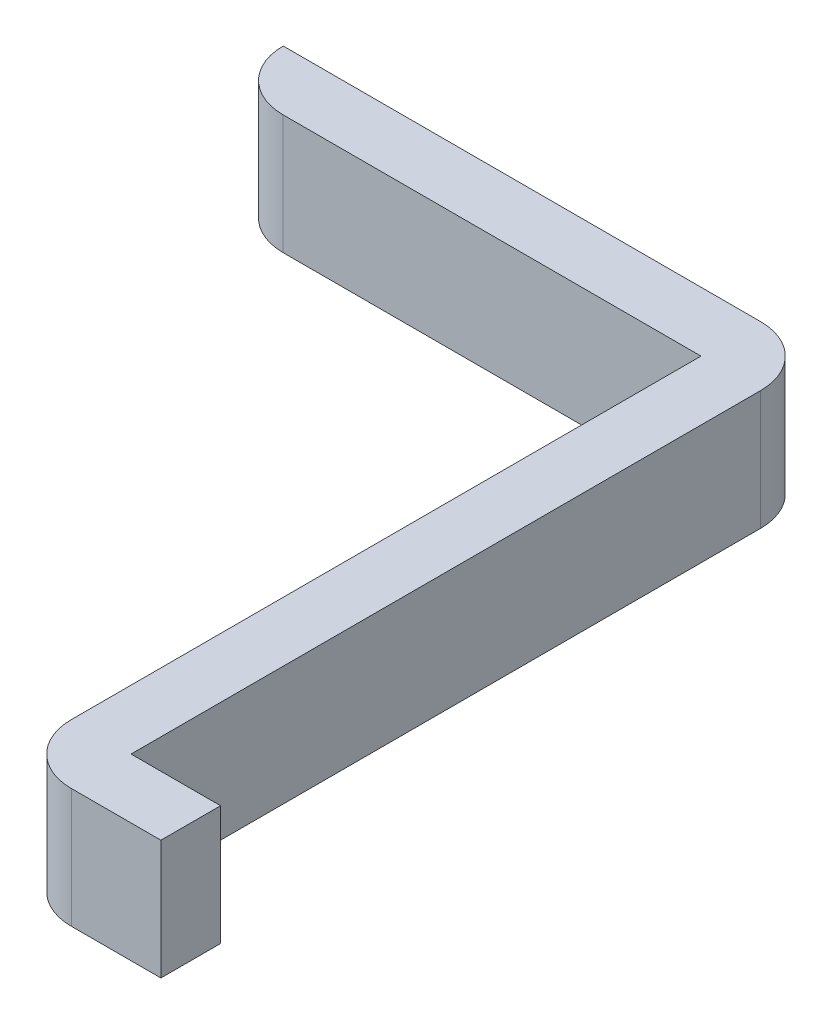
ISO-10303-21;
HEADER;
FILE_DESCRIPTION(('STEP AP214'),'2;1');
FILE_NAME('part.step','',(''),(''),'','','');
FILE_SCHEMA(('AUTOMOTIVE_DESIGN { 1 0 10303 214 1 1 1 1 }'));
ENDSEC;
DATA;
#1=APPLICATION_CONTEXT('core data for automotive mechanical design processes');
#2=APPLICATION_PROTOCOL_DEFINITION('international standard','automotive_design',2000,#1);
#3=PRODUCT_CONTEXT('',#1,'mechanical');
#4=PRODUCT('Part','Part','',(#3));
#5=PRODUCT_RELATED_PRODUCT_CATEGORY('part','',(#4));
#6=PRODUCT_DEFINITION_FORMATION('','',#4);
#7=PRODUCT_DEFINITION_CONTEXT('part definition',#1,'design');
#8=PRODUCT_DEFINITION('design','',#6,#7);
#9=PRODUCT_DEFINITION_SHAPE('','',#8);
#10=(LENGTH_UNIT() NAMED_UNIT(*) SI_UNIT(.MILLI.,.METRE.));
#11=(NAMED_UNIT(*) PLANE_ANGLE_UNIT() SI_UNIT($,.RADIAN.));
#12=(NAMED_UNIT(*) SI_UNIT($,.STERADIAN.) SOLID_ANGLE_UNIT());
#13=UNCERTAINTY_MEASURE_WITH_UNIT(LENGTH_MEASURE(1.E-05),#10,'distance_accuracy_value','');
#14=(GEOMETRIC_REPRESENTATION_CONTEXT(3) GLOBAL_UNCERTAINTY_ASSIGNED_CONTEXT((#13)) GLOBAL_UNIT_ASSIGNED_CONTEXT((#10,
#11,#12)) REPRESENTATION_CONTEXT('',''));
#15=CARTESIAN_POINT('',(0.,0.,0.));
#16=DIRECTION('',(0.,0.,1.));
#17=DIRECTION('',(1.,0.,0.));
#18=AXIS2_PLACEMENT_3D('',#15,#16,#17);
#19=CARTESIAN_POINT('',(-0.05,-1.2,0.));
#20=DIRECTION('',(0.,-1.,0.));
#21=DIRECTION('',(0.,0.,-1.));
#22=AXIS2_PLACEMENT_3D('',#19,#20,#21);
#23=PLANE('',#22);
#24=DIRECTION('',(-1.,0.,0.));
#25=VECTOR('',#24,1.);
#26=CARTESIAN_POINT('',(0.05,-1.2,0.1));
#27=LINE('',#26,#25);
#28=CARTESIAN_POINT('',(0.05,-1.2,0.1));
#29=VERTEX_POINT('',#28);
#30=CARTESIAN_POINT('',(0.75,-1.2,0.1));
#31=VERTEX_POINT('',#30);
#32=EDGE_CURVE('E102',#29,#31,#27,.F.);
#33=ORIENTED_EDGE('',*,*,#32,.T.);
#34=DIRECTION('',(0.,0.,-1.));
#35=VECTOR('',#34,1.);
#36=CARTESIAN_POINT('',(0.75,-1.2,0.1));
#37=LINE('',#36,#35);
#38=CARTESIAN_POINT('',(0.75,-1.2,1.155));
#39=VERTEX_POINT('',#38);
#40=EDGE_CURVE('E105',#31,#39,#37,.F.);
#41=ORIENTED_EDGE('',*,*,#40,.T.);
#42=CARTESIAN_POINT('',(0.85,-1.2,1.155));
#43=DIRECTION('',(0.,-1.,0.));
#44=DIRECTION('',(0.,0.,-1.));
#45=AXIS2_PLACEMENT_3D('',#42,#43,#44);
#46=CIRCLE('',#45,0.1);
#47=CARTESIAN_POINT('',(0.85,-1.2,1.255));
#48=VERTEX_POINT('',#47);
#49=EDGE_CURVE('E117',#48,#39,#46,.T.);
#50=ORIENTED_EDGE('',*,*,#49,.F.);
#51=DIRECTION('',(-1.,0.,0.));
#52=VECTOR('',#51,1.);
#53=CARTESIAN_POINT('',(0.85,-1.2,1.255));
#54=LINE('',#53,#52);
#55=CARTESIAN_POINT('',(1.,-1.2,1.255));
#56=VERTEX_POINT('',#55);
#57=EDGE_CURVE('E134',#48,#56,#54,.F.);
#58=ORIENTED_EDGE('',*,*,#57,.T.);
#59=DIRECTION('',(0.,0.,1.));
#60=VECTOR('',#59,1.);
#61=CARTESIAN_POINT('',(1.,-1.2,1.255));
#62=LINE('',#61,#60);
#63=CARTESIAN_POINT('',(1.,-1.2,1.155));
#64=VERTEX_POINT('',#63);
#65=EDGE_CURVE('E90',#56,#64,#62,.F.);
#66=ORIENTED_EDGE('',*,*,#65,.T.);
#67=DIRECTION('',(1.,0.,0.));
#68=VECTOR('',#67,1.);
#69=CARTESIAN_POINT('',(1.,-1.2,1.155));
#70=LINE('',#69,#68);
#71=CARTESIAN_POINT('',(0.85,-1.2,1.155));
#72=VERTEX_POINT('',#71);
#73=EDGE_CURVE('E87',#64,#72,#70,.F.);
#74=ORIENTED_EDGE('',*,*,#73,.T.);
#75=DIRECTION('',(0.,0.,1.));
#76=VECTOR('',#75,1.);
#77=CARTESIAN_POINT('',(0.85,-1.2,1.155));
#78=LINE('',#77,#76);
#79=CARTESIAN_POINT('',(0.85,-1.2,0.1));
#80=VERTEX_POINT('',#79);
#81=EDGE_CURVE('E82',#72,#80,#78,.F.);
#82=ORIENTED_EDGE('',*,*,#81,.T.);
#83=CARTESIAN_POINT('',(0.75,-1.2,0.1));
#84=DIRECTION('',(0.,-1.,0.));
#85=DIRECTION('',(0.,0.,-1.));
#86=AXIS2_PLACEMENT_3D('',#83,#84,#85);
#87=CIRCLE('',#86,0.1);
#88=CARTESIAN_POINT('',(0.75,-1.2,0.));
#89=VERTEX_POINT('',#88);
#90=EDGE_CURVE('E20',#89,#80,#87,.T.);
#91=ORIENTED_EDGE('',*,*,#90,.F.);
#92=DIRECTION('',(1.,0.,0.));
#93=VECTOR('',#92,1.);
#94=CARTESIAN_POINT('',(0.75,-1.2,0.));
#95=LINE('',#94,#93);
#96=CARTESIAN_POINT('',(-0.05,-1.2,0.));
#97=VERTEX_POINT('',#96);
#98=EDGE_CURVE('E76',#89,#97,#95,.F.);
#99=ORIENTED_EDGE('',*,*,#98,.T.);
#100=CARTESIAN_POINT('',(0.05,-1.2,0.));
#101=DIRECTION('',(0.,-1.,0.));
#102=DIRECTION('',(0.,0.,-1.));
#103=AXIS2_PLACEMENT_3D('',#100,#101,#102);
#104=CIRCLE('',#103,0.1);
#105=EDGE_CURVE('E108',#29,#97,#104,.T.);
#106=ORIENTED_EDGE('',*,*,#105,.F.);
#107=EDGE_LOOP('',(#33,#41,#50,#58,#66,#74,#82,#91,#99,#106));
#108=FACE_BOUND('',#107,.T.);
#109=ADVANCED_FACE('F17',(#108),#23,.F.);
#110=CARTESIAN_POINT('',(0.75,-1.4,0.));
#111=DIRECTION('',(0.,0.,1.));
#112=DIRECTION('',(1.,0.,0.));
#113=AXIS2_PLACEMENT_3D('',#110,#111,#112);
#114=PLANE('',#113);
#115=DIRECTION('',(0.,-1.,0.));
#116=VECTOR('',#115,1.);
#117=CARTESIAN_POINT('',(-0.05,-1.4,0.));
#118=LINE('',#117,#116);
#119=CARTESIAN_POINT('',(-0.05,-1.4,0.));
#120=VERTEX_POINT('',#119);
#121=EDGE_CURVE('E187',#97,#120,#118,.T.);
#122=ORIENTED_EDGE('',*,*,#121,.F.);
#123=ORIENTED_EDGE('',*,*,#98,.F.);
#124=DIRECTION('',(0.,-1.,0.));
#125=VECTOR('',#124,1.);
#126=CARTESIAN_POINT('',(0.75,-1.4,0.));
#127=LINE('',#126,#125);
#128=CARTESIAN_POINT('',(0.75,-1.4,0.));
#129=VERTEX_POINT('',#128);
#130=EDGE_CURVE('E159',#129,#89,#127,.F.);
#131=ORIENTED_EDGE('',*,*,#130,.F.);
#132=DIRECTION('',(1.,0.,0.));
#133=VECTOR('',#132,1.);
#134=CARTESIAN_POINT('',(-0.05,-1.4,0.));
#135=LINE('',#134,#133);
#136=EDGE_CURVE('E186',#120,#129,#135,.T.);
#137=ORIENTED_EDGE('',*,*,#136,.F.);
#138=EDGE_LOOP('',(#122,#123,#131,#137));
#139=FACE_BOUND('',#138,.T.);
#140=ADVANCED_FACE('F217',(#139),#114,.F.);
#141=CARTESIAN_POINT('',(0.75,-1.4,0.1));
#142=DIRECTION('',(0.,-1.,0.));
#143=DIRECTION('',(0.,0.,-1.));
#144=AXIS2_PLACEMENT_3D('',#141,#142,#143);
#145=CYLINDRICAL_SURFACE('',#144,0.1);
#146=ORIENTED_EDGE('',*,*,#90,.T.);
#147=DIRECTION('',(0.,1.,0.));
#148=VECTOR('',#147,1.);
#149=CARTESIAN_POINT('',(0.85,-1.4,0.1));
#150=LINE('',#149,#148);
#151=CARTESIAN_POINT('',(0.85,-1.4,0.1));
#152=VERTEX_POINT('',#151);
#153=EDGE_CURVE('E157',#80,#152,#150,.F.);
#154=ORIENTED_EDGE('',*,*,#153,.T.);
#155=CARTESIAN_POINT('',(0.75,-1.4,0.1));
#156=DIRECTION('',(0.,-1.,0.));
#157=DIRECTION('',(0.,0.,-1.));
#158=AXIS2_PLACEMENT_3D('',#155,#156,#157);
#159=CIRCLE('',#158,0.1);
#160=EDGE_CURVE('E183',#129,#152,#159,.T.);
#161=ORIENTED_EDGE('',*,*,#160,.F.);
#162=ORIENTED_EDGE('',*,*,#130,.T.);
#163=EDGE_LOOP('',(#146,#154,#161,#162));
#164=FACE_BOUND('',#163,.T.);
#165=ADVANCED_FACE('F214',(#164),#145,.T.);
#166=CARTESIAN_POINT('',(0.85,-1.4,1.155));
#167=DIRECTION('',(-1.,0.,0.));
#168=DIRECTION('',(0.,0.,1.));
#169=AXIS2_PLACEMENT_3D('',#166,#167,#168);
#170=PLANE('',#169);
#171=ORIENTED_EDGE('',*,*,#153,.F.);
#172=ORIENTED_EDGE('',*,*,#81,.F.);
#173=DIRECTION('',(0.,1.,0.));
#174=VECTOR('',#173,1.);
#175=CARTESIAN_POINT('',(0.85,-1.4,1.155));
#176=LINE('',#175,#174);
#177=CARTESIAN_POINT('',(0.85,-1.4,1.155));
#178=VERTEX_POINT('',#177);
#179=EDGE_CURVE('E153',#72,#178,#176,.F.);
#180=ORIENTED_EDGE('',*,*,#179,.T.);
#181=DIRECTION('',(0.,0.,-1.));
#182=VECTOR('',#181,1.);
#183=CARTESIAN_POINT('',(0.85,-1.4,0.));
#184=LINE('',#183,#182);
#185=EDGE_CURVE('E150',#152,#178,#184,.F.);
#186=ORIENTED_EDGE('',*,*,#185,.F.);
#187=EDGE_LOOP('',(#171,#172,#180,#186));
#188=FACE_BOUND('',#187,.T.);
#189=ADVANCED_FACE('F211',(#188),#170,.F.);
#190=CARTESIAN_POINT('',(1.,-1.4,1.155));
#191=DIRECTION('',(0.,0.,1.));
#192=DIRECTION('',(1.,0.,0.));
#193=AXIS2_PLACEMENT_3D('',#190,#191,#192);
#194=PLANE('',#193);
#195=ORIENTED_EDGE('',*,*,#179,.F.);
#196=ORIENTED_EDGE('',*,*,#73,.F.);
#197=DIRECTION('',(0.,1.,0.));
#198=VECTOR('',#197,1.);
#199=CARTESIAN_POINT('',(1.,-1.4,1.155));
#200=LINE('',#199,#198);
#201=CARTESIAN_POINT('',(1.,-1.4,1.155));
#202=VERTEX_POINT('',#201);
#203=EDGE_CURVE('E144',#64,#202,#200,.F.);
#204=ORIENTED_EDGE('',*,*,#203,.T.);
#205=DIRECTION('',(1.,0.,0.));
#206=VECTOR('',#205,1.);
#207=CARTESIAN_POINT('',(-0.05,-1.4,1.155));
#208=LINE('',#207,#206);
#209=EDGE_CURVE('E141',#178,#202,#208,.T.);
#210=ORIENTED_EDGE('',*,*,#209,.F.);
#211=EDGE_LOOP('',(#195,#196,#204,#210));
#212=FACE_BOUND('',#211,.T.);
#213=ADVANCED_FACE('F208',(#212),#194,.F.);
#214=CARTESIAN_POINT('',(1.,-1.4,1.255));
#215=DIRECTION('',(-1.,0.,0.));
#216=DIRECTION('',(0.,0.,1.));
#217=AXIS2_PLACEMENT_3D('',#214,#215,#216);
#218=PLANE('',#217);
#219=ORIENTED_EDGE('',*,*,#203,.F.);
#220=ORIENTED_EDGE('',*,*,#65,.F.);
#221=DIRECTION('',(0.,1.,0.));
#222=VECTOR('',#221,1.);
#223=CARTESIAN_POINT('',(1.,-1.4,1.255));
#224=LINE('',#223,#222);
#225=CARTESIAN_POINT('',(1.,-1.4,1.255));
#226=VERTEX_POINT('',#225);
#227=EDGE_CURVE('E132',#56,#226,#224,.F.);
#228=ORIENTED_EDGE('',*,*,#227,.T.);
#229=DIRECTION('',(0.,0.,-1.));
#230=VECTOR('',#229,1.);
#231=CARTESIAN_POINT('',(1.,-1.4,0.));
#232=LINE('',#231,#230);
#233=EDGE_CURVE('E137',#202,#226,#232,.F.);
#234=ORIENTED_EDGE('',*,*,#233,.F.);
#235=EDGE_LOOP('',(#219,#220,#228,#234));
#236=FACE_BOUND('',#235,.T.);
#237=ADVANCED_FACE('F195',(#236),#218,.F.);
#238=CARTESIAN_POINT('',(0.85,-1.4,1.255));
#239=DIRECTION('',(0.,0.,-1.));
#240=DIRECTION('',(-1.,0.,0.));
#241=AXIS2_PLACEMENT_3D('',#238,#239,#240);
#242=PLANE('',#241);
#243=ORIENTED_EDGE('',*,*,#227,.F.);
#244=ORIENTED_EDGE('',*,*,#57,.F.);
#245=DIRECTION('',(0.,-1.,0.));
#246=VECTOR('',#245,1.);
#247=CARTESIAN_POINT('',(0.85,-1.4,1.255));
#248=LINE('',#247,#246);
#249=CARTESIAN_POINT('',(0.85,-1.4,1.255));
#250=VERTEX_POINT('',#249);
#251=EDGE_CURVE('E129',#250,#48,#248,.F.);
#252=ORIENTED_EDGE('',*,*,#251,.F.);
#253=DIRECTION('',(1.,0.,0.));
#254=VECTOR('',#253,1.);
#255=CARTESIAN_POINT('',(-0.05,-1.4,1.255));
#256=LINE('',#255,#254);
#257=EDGE_CURVE('E140',#226,#250,#256,.F.);
#258=ORIENTED_EDGE('',*,*,#257,.F.);
#259=EDGE_LOOP('',(#243,#244,#252,#258));
#260=FACE_BOUND('',#259,.T.);
#261=ADVANCED_FACE('F198',(#260),#242,.F.);
#262=CARTESIAN_POINT('',(0.85,-1.4,1.155));
#263=DIRECTION('',(0.,-1.,0.));
#264=DIRECTION('',(0.,0.,-1.));
#265=AXIS2_PLACEMENT_3D('',#262,#263,#264);
#266=CYLINDRICAL_SURFACE('',#265,0.1);
#267=ORIENTED_EDGE('',*,*,#49,.T.);
#268=DIRECTION('',(0.,1.,0.));
#269=VECTOR('',#268,1.);
#270=CARTESIAN_POINT('',(0.75,-1.4,1.155));
#271=LINE('',#270,#269);
#272=CARTESIAN_POINT('',(0.75,-1.4,1.155));
#273=VERTEX_POINT('',#272);
#274=EDGE_CURVE('E111',#39,#273,#271,.F.);
#275=ORIENTED_EDGE('',*,*,#274,.T.);
#276=CARTESIAN_POINT('',(0.85,-1.4,1.155));
#277=DIRECTION('',(0.,-1.,0.));
#278=DIRECTION('',(0.,0.,-1.));
#279=AXIS2_PLACEMENT_3D('',#276,#277,#278);
#280=CIRCLE('',#279,0.1);
#281=EDGE_CURVE('E179',#250,#273,#280,.T.);
#282=ORIENTED_EDGE('',*,*,#281,.F.);
#283=ORIENTED_EDGE('',*,*,#251,.T.);
#284=EDGE_LOOP('',(#267,#275,#282,#283));
#285=FACE_BOUND('',#284,.T.);
#286=ADVANCED_FACE('F189',(#285),#266,.T.);
#287=CARTESIAN_POINT('',(0.75,-1.4,0.1));
#288=DIRECTION('',(1.,0.,0.));
#289=DIRECTION('',(0.,0.,-1.));
#290=AXIS2_PLACEMENT_3D('',#287,#288,#289);
#291=PLANE('',#290);
#292=ORIENTED_EDGE('',*,*,#274,.F.);
#293=ORIENTED_EDGE('',*,*,#40,.F.);
#294=DIRECTION('',(0.,1.,0.));
#295=VECTOR('',#294,1.);
#296=CARTESIAN_POINT('',(0.75,-1.4,0.1));
#297=LINE('',#296,#295);
#298=CARTESIAN_POINT('',(0.75,-1.4,0.1));
#299=VERTEX_POINT('',#298);
#300=EDGE_CURVE('E110',#31,#299,#297,.F.);
#301=ORIENTED_EDGE('',*,*,#300,.T.);
#302=DIRECTION('',(0.,0.,-1.));
#303=VECTOR('',#302,1.);
#304=CARTESIAN_POINT('',(0.75,-1.4,0.));
#305=LINE('',#304,#303);
#306=EDGE_CURVE('E182',#273,#299,#305,.T.);
#307=ORIENTED_EDGE('',*,*,#306,.F.);
#308=EDGE_LOOP('',(#292,#293,#301,#307));
#309=FACE_BOUND('',#308,.T.);
#310=ADVANCED_FACE('F115',(#309),#291,.F.);
#311=CARTESIAN_POINT('',(0.05,-1.4,0.1));
#312=DIRECTION('',(0.,0.,-1.));
#313=DIRECTION('',(-1.,0.,0.));
#314=AXIS2_PLACEMENT_3D('',#311,#312,#313);
#315=PLANE('',#314);
#316=ORIENTED_EDGE('',*,*,#300,.F.);
#317=ORIENTED_EDGE('',*,*,#32,.F.);
#318=DIRECTION('',(0.,-1.,0.));
#319=VECTOR('',#318,1.);
#320=CARTESIAN_POINT('',(0.05,-1.4,0.1));
#321=LINE('',#320,#319);
#322=CARTESIAN_POINT('',(0.05,-1.4,0.1));
#323=VERTEX_POINT('',#322);
#324=EDGE_CURVE('E35',#323,#29,#321,.F.);
#325=ORIENTED_EDGE('',*,*,#324,.F.);
#326=DIRECTION('',(1.,0.,0.));
#327=VECTOR('',#326,1.);
#328=CARTESIAN_POINT('',(-0.05,-1.4,0.1));
#329=LINE('',#328,#327);
#330=EDGE_CURVE('E26',#299,#323,#329,.F.);
#331=ORIENTED_EDGE('',*,*,#330,.F.);
#332=EDGE_LOOP('',(#316,#317,#325,#331));
#333=FACE_BOUND('',#332,.T.);
#334=ADVANCED_FACE('F119',(#333),#315,.F.);
#335=CARTESIAN_POINT('',(0.05,-1.4,0.));
#336=DIRECTION('',(0.,-1.,0.));
#337=DIRECTION('',(0.,0.,-1.));
#338=AXIS2_PLACEMENT_3D('',#335,#336,#337);
#339=CYLINDRICAL_SURFACE('',#338,0.1);
#340=ORIENTED_EDGE('',*,*,#105,.T.);
#341=ORIENTED_EDGE('',*,*,#121,.T.);
#342=CARTESIAN_POINT('',(0.05,-1.4,0.));
#343=DIRECTION('',(0.,-1.,0.));
#344=DIRECTION('',(0.,0.,-1.));
#345=AXIS2_PLACEMENT_3D('',#342,#343,#344);
#346=CIRCLE('',#345,0.1);
#347=EDGE_CURVE('E11',#323,#120,#346,.T.);
#348=ORIENTED_EDGE('',*,*,#347,.F.);
#349=ORIENTED_EDGE('',*,*,#324,.T.);
#350=EDGE_LOOP('',(#340,#341,#348,#349));
#351=FACE_BOUND('',#350,.T.);
#352=ADVANCED_FACE('F219',(#351),#339,.T.);
#353=CARTESIAN_POINT('',(-0.05,-1.4,0.));
#354=DIRECTION('',(0.,-1.,0.));
#355=DIRECTION('',(0.,0.,-1.));
#356=AXIS2_PLACEMENT_3D('',#353,#354,#355);
#357=PLANE('',#356);
#358=ORIENTED_EDGE('',*,*,#330,.T.);
#359=ORIENTED_EDGE('',*,*,#347,.T.);
#360=ORIENTED_EDGE('',*,*,#136,.T.);
#361=ORIENTED_EDGE('',*,*,#160,.T.);
#362=ORIENTED_EDGE('',*,*,#185,.T.);
#363=ORIENTED_EDGE('',*,*,#209,.T.);
#364=ORIENTED_EDGE('',*,*,#233,.T.);
#365=ORIENTED_EDGE('',*,*,#257,.T.);
#366=ORIENTED_EDGE('',*,*,#281,.T.);
#367=ORIENTED_EDGE('',*,*,#306,.T.);
#368=EDGE_LOOP('',(#358,#359,#360,#361,#362,#363,#364,#365,#366,#367));
#369=FACE_BOUND('',#368,.T.);
#370=ADVANCED_FACE('F202',(#369),#357,.T.);
#371=CLOSED_SHELL('',(#109,#140,#165,#189,#213,#237,#261,#286,#310,#334,#352,#370));
#372=MANIFOLD_SOLID_BREP('B1',#371);
#373=ADVANCED_BREP_SHAPE_REPRESENTATION('',(#18,#372),#14);
#374=SHAPE_DEFINITION_REPRESENTATION(#9,#373);
ENDSEC;
END-ISO-10303-21;
